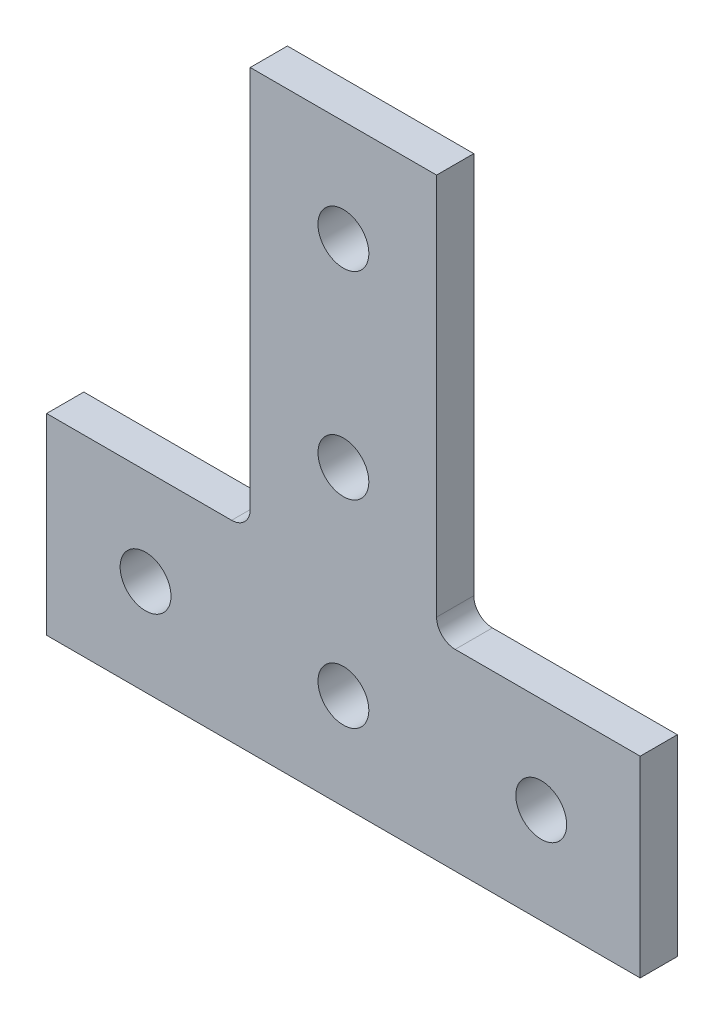
ISO-10303-21;
HEADER;
FILE_DESCRIPTION(('STEP AP214'),'2;1');
FILE_NAME('part.step','',(''),(''),'','','');
FILE_SCHEMA(('AUTOMOTIVE_DESIGN { 1 0 10303 214 1 1 1 1 }'));
ENDSEC;
DATA;
#1=APPLICATION_CONTEXT('core data for automotive mechanical design processes');
#2=APPLICATION_PROTOCOL_DEFINITION('international standard','automotive_design',2000,#1);
#3=PRODUCT_CONTEXT('',#1,'mechanical');
#4=PRODUCT('Part','Part','',(#3));
#5=PRODUCT_RELATED_PRODUCT_CATEGORY('part','',(#4));
#6=PRODUCT_DEFINITION_FORMATION('','',#4);
#7=PRODUCT_DEFINITION_CONTEXT('part definition',#1,'design');
#8=PRODUCT_DEFINITION('design','',#6,#7);
#9=PRODUCT_DEFINITION_SHAPE('','',#8);
#10=(LENGTH_UNIT() NAMED_UNIT(*) SI_UNIT(.MILLI.,.METRE.));
#11=(NAMED_UNIT(*) PLANE_ANGLE_UNIT() SI_UNIT($,.RADIAN.));
#12=(NAMED_UNIT(*) SI_UNIT($,.STERADIAN.) SOLID_ANGLE_UNIT());
#13=UNCERTAINTY_MEASURE_WITH_UNIT(LENGTH_MEASURE(1.E-05),#10,'distance_accuracy_value','');
#14=(GEOMETRIC_REPRESENTATION_CONTEXT(3) GLOBAL_UNCERTAINTY_ASSIGNED_CONTEXT((#13)) GLOBAL_UNIT_ASSIGNED_CONTEXT((#10,
#11,#12)) REPRESENTATION_CONTEXT('',''));
#15=CARTESIAN_POINT('',(0.,0.,0.));
#16=DIRECTION('',(0.,0.,1.));
#17=DIRECTION('',(1.,0.,0.));
#18=AXIS2_PLACEMENT_3D('',#15,#16,#17);
#19=CARTESIAN_POINT('',(-11.9634,-11.049,-2.3876));
#20=DIRECTION('',(-1.,0.,0.));
#21=DIRECTION('',(0.,-1.,0.));
#22=AXIS2_PLACEMENT_3D('',#19,#20,#21);
#23=PLANE('',#22);
#24=DIRECTION('',(0.,0.,1.));
#25=VECTOR('',#24,1.);
#26=CARTESIAN_POINT('',(-11.9634,-11.049,-2.3876));
#27=LINE('',#26,#25);
#28=CARTESIAN_POINT('',(-11.9634,-11.049,-2.3876));
#29=VERTEX_POINT('',#28);
#30=CARTESIAN_POINT('',(-11.9634,-11.049,2.3876));
#31=VERTEX_POINT('',#30);
#32=EDGE_CURVE('E44',#29,#31,#27,.T.);
#33=ORIENTED_EDGE('',*,*,#32,.T.);
#34=DIRECTION('',(0.,-1.,0.));
#35=VECTOR('',#34,1.);
#36=CARTESIAN_POINT('',(-11.9634,-11.049,2.3876));
#37=LINE('',#36,#35);
#38=CARTESIAN_POINT('',(-11.9634,38.1,2.3876));
#39=VERTEX_POINT('',#38);
#40=EDGE_CURVE('E118',#39,#31,#37,.T.);
#41=ORIENTED_EDGE('',*,*,#40,.F.);
#42=DIRECTION('',(0.,0.,1.));
#43=VECTOR('',#42,1.);
#44=CARTESIAN_POINT('',(-11.9634,38.1,-2.3876));
#45=LINE('',#44,#43);
#46=CARTESIAN_POINT('',(-11.9634,38.1,-2.3876));
#47=VERTEX_POINT('',#46);
#48=EDGE_CURVE('E11',#47,#39,#45,.T.);
#49=ORIENTED_EDGE('',*,*,#48,.F.);
#50=DIRECTION('',(0.,-1.,0.));
#51=VECTOR('',#50,1.);
#52=CARTESIAN_POINT('',(-11.9634,-11.049,-2.3876));
#53=LINE('',#52,#51);
#54=EDGE_CURVE('E119',#47,#29,#53,.T.);
#55=ORIENTED_EDGE('',*,*,#54,.T.);
#56=EDGE_LOOP('',(#33,#41,#49,#55));
#57=FACE_BOUND('',#56,.T.);
#58=ADVANCED_FACE('F41',(#57),#23,.T.);
#59=CARTESIAN_POINT('',(11.9634,38.1,-2.3876));
#60=DIRECTION('',(0.,1.,0.));
#61=DIRECTION('',(0.,0.,1.));
#62=AXIS2_PLACEMENT_3D('',#59,#60,#61);
#63=PLANE('',#62);
#64=ORIENTED_EDGE('',*,*,#48,.T.);
#65=DIRECTION('',(-1.,0.,0.));
#66=VECTOR('',#65,1.);
#67=CARTESIAN_POINT('',(11.9634,38.1,2.3876));
#68=LINE('',#67,#66);
#69=CARTESIAN_POINT('',(11.9634,38.1,2.3876));
#70=VERTEX_POINT('',#69);
#71=EDGE_CURVE('E138',#70,#39,#68,.T.);
#72=ORIENTED_EDGE('',*,*,#71,.F.);
#73=DIRECTION('',(0.,0.,1.));
#74=VECTOR('',#73,1.);
#75=CARTESIAN_POINT('',(11.9634,38.1,-2.3876));
#76=LINE('',#75,#74);
#77=CARTESIAN_POINT('',(11.9634,38.1,-2.3876));
#78=VERTEX_POINT('',#77);
#79=EDGE_CURVE('E50',#78,#70,#76,.T.);
#80=ORIENTED_EDGE('',*,*,#79,.F.);
#81=DIRECTION('',(-1.,0.,0.));
#82=VECTOR('',#81,1.);
#83=CARTESIAN_POINT('',(11.9634,38.1,-2.3876));
#84=LINE('',#83,#82);
#85=EDGE_CURVE('E125',#78,#47,#84,.T.);
#86=ORIENTED_EDGE('',*,*,#85,.T.);
#87=EDGE_LOOP('',(#64,#72,#80,#86));
#88=FACE_BOUND('',#87,.T.);
#89=ADVANCED_FACE('F291',(#88),#63,.T.);
#90=CARTESIAN_POINT('',(11.9634,-11.049,-2.3876));
#91=DIRECTION('',(1.,0.,0.));
#92=DIRECTION('',(0.,0.,-1.));
#93=AXIS2_PLACEMENT_3D('',#90,#91,#92);
#94=PLANE('',#93);
#95=ORIENTED_EDGE('',*,*,#79,.T.);
#96=DIRECTION('',(0.,1.,0.));
#97=VECTOR('',#96,1.);
#98=CARTESIAN_POINT('',(11.9634,-11.049,2.3876));
#99=LINE('',#98,#97);
#100=CARTESIAN_POINT('',(11.9634,-11.049,2.3876));
#101=VERTEX_POINT('',#100);
#102=EDGE_CURVE('E173',#101,#70,#99,.T.);
#103=ORIENTED_EDGE('',*,*,#102,.F.);
#104=DIRECTION('',(0.,0.,1.));
#105=VECTOR('',#104,1.);
#106=CARTESIAN_POINT('',(11.9634,-11.049,-2.3876));
#107=LINE('',#106,#105);
#108=CARTESIAN_POINT('',(11.9634,-11.049,-2.3876));
#109=VERTEX_POINT('',#108);
#110=EDGE_CURVE('E214',#109,#101,#107,.T.);
#111=ORIENTED_EDGE('',*,*,#110,.F.);
#112=DIRECTION('',(0.,1.,0.));
#113=VECTOR('',#112,1.);
#114=CARTESIAN_POINT('',(11.9634,-11.049,-2.3876));
#115=LINE('',#114,#113);
#116=EDGE_CURVE('E207',#109,#78,#115,.T.);
#117=ORIENTED_EDGE('',*,*,#116,.T.);
#118=EDGE_LOOP('',(#95,#103,#111,#117));
#119=FACE_BOUND('',#118,.T.);
#120=ADVANCED_FACE('F289',(#119),#94,.T.);
#121=CARTESIAN_POINT('',(14.351,-11.049,-2.3876));
#122=DIRECTION('',(0.,0.,1.));
#123=DIRECTION('',(1.,0.,0.));
#124=AXIS2_PLACEMENT_3D('',#121,#122,#123);
#125=CYLINDRICAL_SURFACE('',#124,2.3876);
#126=ORIENTED_EDGE('',*,*,#110,.T.);
#127=CARTESIAN_POINT('',(14.351,-11.049,2.3876));
#128=DIRECTION('',(0.,0.,-1.));
#129=DIRECTION('',(-1.,0.,0.));
#130=AXIS2_PLACEMENT_3D('',#127,#128,#129);
#131=CIRCLE('',#130,2.3876);
#132=CARTESIAN_POINT('',(14.351,-13.4366,2.3876));
#133=VERTEX_POINT('',#132);
#134=EDGE_CURVE('E169',#133,#101,#131,.T.);
#135=ORIENTED_EDGE('',*,*,#134,.F.);
#136=DIRECTION('',(0.,0.,1.));
#137=VECTOR('',#136,1.);
#138=CARTESIAN_POINT('',(14.351,-13.4366,-2.3876));
#139=LINE('',#138,#137);
#140=CARTESIAN_POINT('',(14.351,-13.4366,-2.3876));
#141=VERTEX_POINT('',#140);
#142=EDGE_CURVE('E217',#141,#133,#139,.T.);
#143=ORIENTED_EDGE('',*,*,#142,.F.);
#144=CARTESIAN_POINT('',(14.351,-11.049,-2.3876));
#145=DIRECTION('',(0.,0.,-1.));
#146=DIRECTION('',(-1.,0.,0.));
#147=AXIS2_PLACEMENT_3D('',#144,#145,#146);
#148=CIRCLE('',#147,2.3876);
#149=EDGE_CURVE('E203',#141,#109,#148,.T.);
#150=ORIENTED_EDGE('',*,*,#149,.T.);
#151=EDGE_LOOP('',(#126,#135,#143,#150));
#152=FACE_BOUND('',#151,.T.);
#153=ADVANCED_FACE('F285',(#152),#125,.F.);
#154=CARTESIAN_POINT('',(38.1,-13.4366,-2.3876));
#155=DIRECTION('',(0.,1.,0.));
#156=DIRECTION('',(-1.,0.,0.));
#157=AXIS2_PLACEMENT_3D('',#154,#155,#156);
#158=PLANE('',#157);
#159=ORIENTED_EDGE('',*,*,#142,.T.);
#160=DIRECTION('',(-1.,0.,0.));
#161=VECTOR('',#160,1.);
#162=CARTESIAN_POINT('',(38.1,-13.4366,2.3876));
#163=LINE('',#162,#161);
#164=CARTESIAN_POINT('',(38.1,-13.4366,2.3876));
#165=VERTEX_POINT('',#164);
#166=EDGE_CURVE('E165',#165,#133,#163,.T.);
#167=ORIENTED_EDGE('',*,*,#166,.F.);
#168=DIRECTION('',(0.,0.,1.));
#169=VECTOR('',#168,1.);
#170=CARTESIAN_POINT('',(38.1,-13.4366,-2.3876));
#171=LINE('',#170,#169);
#172=CARTESIAN_POINT('',(38.1,-13.4366,-2.3876));
#173=VERTEX_POINT('',#172);
#174=EDGE_CURVE('E220',#173,#165,#171,.T.);
#175=ORIENTED_EDGE('',*,*,#174,.F.);
#176=DIRECTION('',(-1.,0.,0.));
#177=VECTOR('',#176,1.);
#178=CARTESIAN_POINT('',(38.1,-13.4366,-2.3876));
#179=LINE('',#178,#177);
#180=EDGE_CURVE('E199',#173,#141,#179,.T.);
#181=ORIENTED_EDGE('',*,*,#180,.T.);
#182=EDGE_LOOP('',(#159,#167,#175,#181));
#183=FACE_BOUND('',#182,.T.);
#184=ADVANCED_FACE('F283',(#183),#158,.T.);
#185=CARTESIAN_POINT('',(38.1,-38.1,-2.3876));
#186=DIRECTION('',(1.,0.,0.));
#187=DIRECTION('',(0.,0.,-1.));
#188=AXIS2_PLACEMENT_3D('',#185,#186,#187);
#189=PLANE('',#188);
#190=ORIENTED_EDGE('',*,*,#174,.T.);
#191=DIRECTION('',(0.,1.,0.));
#192=VECTOR('',#191,1.);
#193=CARTESIAN_POINT('',(38.1,-38.1,2.3876));
#194=LINE('',#193,#192);
#195=CARTESIAN_POINT('',(38.1,-38.1,2.3876));
#196=VERTEX_POINT('',#195);
#197=EDGE_CURVE('E161',#196,#165,#194,.T.);
#198=ORIENTED_EDGE('',*,*,#197,.F.);
#199=DIRECTION('',(0.,0.,1.));
#200=VECTOR('',#199,1.);
#201=CARTESIAN_POINT('',(38.1,-38.1,-2.3876));
#202=LINE('',#201,#200);
#203=CARTESIAN_POINT('',(38.1,-38.1,-2.3876));
#204=VERTEX_POINT('',#203);
#205=EDGE_CURVE('E223',#204,#196,#202,.T.);
#206=ORIENTED_EDGE('',*,*,#205,.F.);
#207=DIRECTION('',(0.,1.,0.));
#208=VECTOR('',#207,1.);
#209=CARTESIAN_POINT('',(38.1,-38.1,-2.3876));
#210=LINE('',#209,#208);
#211=EDGE_CURVE('E195',#204,#173,#210,.T.);
#212=ORIENTED_EDGE('',*,*,#211,.T.);
#213=EDGE_LOOP('',(#190,#198,#206,#212));
#214=FACE_BOUND('',#213,.T.);
#215=ADVANCED_FACE('F278',(#214),#189,.T.);
#216=CARTESIAN_POINT('',(38.1,-38.1,-2.3876));
#217=DIRECTION('',(0.,-1.,0.));
#218=DIRECTION('',(1.,0.,0.));
#219=AXIS2_PLACEMENT_3D('',#216,#217,#218);
#220=PLANE('',#219);
#221=ORIENTED_EDGE('',*,*,#205,.T.);
#222=DIRECTION('',(1.,0.,0.));
#223=VECTOR('',#222,1.);
#224=CARTESIAN_POINT('',(38.1,-38.1,2.3876));
#225=LINE('',#224,#223);
#226=CARTESIAN_POINT('',(-38.1,-38.1,2.3876));
#227=VERTEX_POINT('',#226);
#228=EDGE_CURVE('E157',#227,#196,#225,.T.);
#229=ORIENTED_EDGE('',*,*,#228,.F.);
#230=DIRECTION('',(0.,0.,1.));
#231=VECTOR('',#230,1.);
#232=CARTESIAN_POINT('',(-38.1,-38.1,-2.3876));
#233=LINE('',#232,#231);
#234=CARTESIAN_POINT('',(-38.1,-38.1,-2.3876));
#235=VERTEX_POINT('',#234);
#236=EDGE_CURVE('E226',#235,#227,#233,.T.);
#237=ORIENTED_EDGE('',*,*,#236,.F.);
#238=DIRECTION('',(1.,0.,0.));
#239=VECTOR('',#238,1.);
#240=CARTESIAN_POINT('',(38.1,-38.1,-2.3876));
#241=LINE('',#240,#239);
#242=EDGE_CURVE('E191',#235,#204,#241,.T.);
#243=ORIENTED_EDGE('',*,*,#242,.T.);
#244=EDGE_LOOP('',(#221,#229,#237,#243));
#245=FACE_BOUND('',#244,.T.);
#246=ADVANCED_FACE('F271',(#245),#220,.T.);
#247=CARTESIAN_POINT('',(-38.1,-38.1,-2.3876));
#248=DIRECTION('',(-1.,0.,0.));
#249=DIRECTION('',(0.,0.,1.));
#250=AXIS2_PLACEMENT_3D('',#247,#248,#249);
#251=PLANE('',#250);
#252=ORIENTED_EDGE('',*,*,#236,.T.);
#253=DIRECTION('',(0.,-1.,0.));
#254=VECTOR('',#253,1.);
#255=CARTESIAN_POINT('',(-38.1,-38.1,2.3876));
#256=LINE('',#255,#254);
#257=CARTESIAN_POINT('',(-38.1,-13.4366,2.3876));
#258=VERTEX_POINT('',#257);
#259=EDGE_CURVE('E153',#258,#227,#256,.T.);
#260=ORIENTED_EDGE('',*,*,#259,.F.);
#261=DIRECTION('',(0.,0.,1.));
#262=VECTOR('',#261,1.);
#263=CARTESIAN_POINT('',(-38.1,-13.4366,-2.3876));
#264=LINE('',#263,#262);
#265=CARTESIAN_POINT('',(-38.1,-13.4366,-2.3876));
#266=VERTEX_POINT('',#265);
#267=EDGE_CURVE('E229',#266,#258,#264,.T.);
#268=ORIENTED_EDGE('',*,*,#267,.F.);
#269=DIRECTION('',(0.,-1.,0.));
#270=VECTOR('',#269,1.);
#271=CARTESIAN_POINT('',(-38.1,-38.1,-2.3876));
#272=LINE('',#271,#270);
#273=EDGE_CURVE('E187',#266,#235,#272,.T.);
#274=ORIENTED_EDGE('',*,*,#273,.T.);
#275=EDGE_LOOP('',(#252,#260,#268,#274));
#276=FACE_BOUND('',#275,.T.);
#277=ADVANCED_FACE('F268',(#276),#251,.T.);
#278=CARTESIAN_POINT('',(-38.1,-13.4366,-2.3876));
#279=DIRECTION('',(0.,1.,0.));
#280=DIRECTION('',(-1.,0.,0.));
#281=AXIS2_PLACEMENT_3D('',#278,#279,#280);
#282=PLANE('',#281);
#283=ORIENTED_EDGE('',*,*,#267,.T.);
#284=DIRECTION('',(-1.,0.,0.));
#285=VECTOR('',#284,1.);
#286=CARTESIAN_POINT('',(-38.1,-13.4366,2.3876));
#287=LINE('',#286,#285);
#288=CARTESIAN_POINT('',(-14.351,-13.4366,2.3876));
#289=VERTEX_POINT('',#288);
#290=EDGE_CURVE('E133',#289,#258,#287,.T.);
#291=ORIENTED_EDGE('',*,*,#290,.F.);
#292=DIRECTION('',(0.,0.,1.));
#293=VECTOR('',#292,1.);
#294=CARTESIAN_POINT('',(-14.351,-13.4366,-2.3876));
#295=LINE('',#294,#293);
#296=CARTESIAN_POINT('',(-14.351,-13.4366,-2.3876));
#297=VERTEX_POINT('',#296);
#298=EDGE_CURVE('E124',#297,#289,#295,.T.);
#299=ORIENTED_EDGE('',*,*,#298,.F.);
#300=DIRECTION('',(-1.,0.,0.));
#301=VECTOR('',#300,1.);
#302=CARTESIAN_POINT('',(-38.1,-13.4366,-2.3876));
#303=LINE('',#302,#301);
#304=EDGE_CURVE('E183',#297,#266,#303,.T.);
#305=ORIENTED_EDGE('',*,*,#304,.T.);
#306=EDGE_LOOP('',(#283,#291,#299,#305));
#307=FACE_BOUND('',#306,.T.);
#308=ADVANCED_FACE('F262',(#307),#282,.T.);
#309=CARTESIAN_POINT('',(-14.351,-11.049,-2.3876));
#310=DIRECTION('',(0.,0.,1.));
#311=DIRECTION('',(1.,0.,0.));
#312=AXIS2_PLACEMENT_3D('',#309,#310,#311);
#313=CYLINDRICAL_SURFACE('',#312,2.3876);
#314=ORIENTED_EDGE('',*,*,#298,.T.);
#315=CARTESIAN_POINT('',(-14.351,-11.049,2.3876));
#316=DIRECTION('',(0.,0.,-1.));
#317=DIRECTION('',(-1.,0.,0.));
#318=AXIS2_PLACEMENT_3D('',#315,#316,#317);
#319=CIRCLE('',#318,2.3876);
#320=EDGE_CURVE('E127',#31,#289,#319,.T.);
#321=ORIENTED_EDGE('',*,*,#320,.F.);
#322=ORIENTED_EDGE('',*,*,#32,.F.);
#323=CARTESIAN_POINT('',(-14.351,-11.049,-2.3876));
#324=DIRECTION('',(0.,0.,-1.));
#325=DIRECTION('',(-1.,0.,0.));
#326=AXIS2_PLACEMENT_3D('',#323,#324,#325);
#327=CIRCLE('',#326,2.3876);
#328=EDGE_CURVE('E180',#29,#297,#327,.T.);
#329=ORIENTED_EDGE('',*,*,#328,.T.);
#330=EDGE_LOOP('',(#314,#321,#322,#329));
#331=FACE_BOUND('',#330,.T.);
#332=ADVANCED_FACE('F128',(#331),#313,.F.);
#333=CARTESIAN_POINT('',(14.351,-11.049,-2.3876));
#334=DIRECTION('',(0.,0.,-1.));
#335=DIRECTION('',(-1.,0.,0.));
#336=AXIS2_PLACEMENT_3D('',#333,#334,#335);
#337=PLANE('',#336);
#338=CARTESIAN_POINT('',(25.4,-25.7683,-2.3876));
#339=DIRECTION('',(0.,0.,1.));
#340=DIRECTION('',(1.,0.,0.));
#341=AXIS2_PLACEMENT_3D('',#338,#339,#340);
#342=CIRCLE('',#341,3.2639);
#343=CARTESIAN_POINT('',(28.6639,-25.7683,-2.3876));
#344=VERTEX_POINT('',#343);
#345=EDGE_CURVE('E140',#344,#344,#342,.T.);
#346=ORIENTED_EDGE('',*,*,#345,.T.);
#347=EDGE_LOOP('',(#346));
#348=FACE_BOUND('',#347,.T.);
#349=CARTESIAN_POINT('',(0.,-25.7683,-2.3876));
#350=DIRECTION('',(0.,0.,1.));
#351=DIRECTION('',(1.,0.,0.));
#352=AXIS2_PLACEMENT_3D('',#349,#350,#351);
#353=CIRCLE('',#352,3.2639);
#354=CARTESIAN_POINT('',(3.2639,-25.7683,-2.3876));
#355=VERTEX_POINT('',#354);
#356=EDGE_CURVE('E328',#355,#355,#353,.T.);
#357=ORIENTED_EDGE('',*,*,#356,.T.);
#358=EDGE_LOOP('',(#357));
#359=FACE_BOUND('',#358,.T.);
#360=CARTESIAN_POINT('',(-25.4,-25.7683,-2.3876));
#361=DIRECTION('',(0.,0.,1.));
#362=DIRECTION('',(1.,0.,0.));
#363=AXIS2_PLACEMENT_3D('',#360,#361,#362);
#364=CIRCLE('',#363,3.2639);
#365=CARTESIAN_POINT('',(-22.1361,-25.7683,-2.3876));
#366=VERTEX_POINT('',#365);
#367=EDGE_CURVE('E332',#366,#366,#364,.T.);
#368=ORIENTED_EDGE('',*,*,#367,.T.);
#369=EDGE_LOOP('',(#368));
#370=FACE_BOUND('',#369,.T.);
#371=CARTESIAN_POINT('',(0.,-0.368299999999988,-2.3876));
#372=DIRECTION('',(0.,0.,1.));
#373=DIRECTION('',(1.,0.,0.));
#374=AXIS2_PLACEMENT_3D('',#371,#372,#373);
#375=CIRCLE('',#374,3.2639);
#376=CARTESIAN_POINT('',(3.2639,-0.368299999999988,-2.3876));
#377=VERTEX_POINT('',#376);
#378=EDGE_CURVE('E336',#377,#377,#375,.T.);
#379=ORIENTED_EDGE('',*,*,#378,.T.);
#380=EDGE_LOOP('',(#379));
#381=FACE_BOUND('',#380,.T.);
#382=CARTESIAN_POINT('',(0.,25.0317,-2.3876));
#383=DIRECTION('',(0.,0.,1.));
#384=DIRECTION('',(-1.,0.,0.));
#385=AXIS2_PLACEMENT_3D('',#382,#383,#384);
#386=CIRCLE('',#385,3.2639);
#387=CARTESIAN_POINT('',(-3.2639,25.0317,-2.3876));
#388=VERTEX_POINT('',#387);
#389=EDGE_CURVE('E339',#388,#388,#386,.T.);
#390=ORIENTED_EDGE('',*,*,#389,.T.);
#391=EDGE_LOOP('',(#390));
#392=FACE_BOUND('',#391,.T.);
#393=ORIENTED_EDGE('',*,*,#54,.F.);
#394=ORIENTED_EDGE('',*,*,#85,.F.);
#395=ORIENTED_EDGE('',*,*,#116,.F.);
#396=ORIENTED_EDGE('',*,*,#149,.F.);
#397=ORIENTED_EDGE('',*,*,#180,.F.);
#398=ORIENTED_EDGE('',*,*,#211,.F.);
#399=ORIENTED_EDGE('',*,*,#242,.F.);
#400=ORIENTED_EDGE('',*,*,#273,.F.);
#401=ORIENTED_EDGE('',*,*,#304,.F.);
#402=ORIENTED_EDGE('',*,*,#328,.F.);
#403=EDGE_LOOP('',(#393,#394,#395,#396,#397,#398,#399,#400,#401,#402));
#404=FACE_BOUND('',#403,.T.);
#405=ADVANCED_FACE('F274',(#348,#359,#370,#381,#392,#404),#337,.T.);
#406=CARTESIAN_POINT('',(14.351,-11.049,2.3876));
#407=DIRECTION('',(0.,0.,-1.));
#408=DIRECTION('',(-1.,0.,0.));
#409=AXIS2_PLACEMENT_3D('',#406,#407,#408);
#410=PLANE('',#409);
#411=CARTESIAN_POINT('',(25.4,-25.7683,2.3876));
#412=DIRECTION('',(0.,0.,1.));
#413=DIRECTION('',(1.,0.,0.));
#414=AXIS2_PLACEMENT_3D('',#411,#412,#413);
#415=CIRCLE('',#414,3.2639);
#416=CARTESIAN_POINT('',(28.6639,-25.7683,2.3876));
#417=VERTEX_POINT('',#416);
#418=EDGE_CURVE('E145',#417,#417,#415,.T.);
#419=ORIENTED_EDGE('',*,*,#418,.F.);
#420=EDGE_LOOP('',(#419));
#421=FACE_BOUND('',#420,.T.);
#422=CARTESIAN_POINT('',(0.,-25.7683,2.3876));
#423=DIRECTION('',(0.,0.,1.));
#424=DIRECTION('',(1.,0.,0.));
#425=AXIS2_PLACEMENT_3D('',#422,#423,#424);
#426=CIRCLE('',#425,3.2639);
#427=CARTESIAN_POINT('',(3.2639,-25.7683,2.3876));
#428=VERTEX_POINT('',#427);
#429=EDGE_CURVE('E358',#428,#428,#426,.T.);
#430=ORIENTED_EDGE('',*,*,#429,.F.);
#431=EDGE_LOOP('',(#430));
#432=FACE_BOUND('',#431,.T.);
#433=CARTESIAN_POINT('',(-25.4,-25.7683,2.3876));
#434=DIRECTION('',(0.,0.,1.));
#435=DIRECTION('',(1.,0.,0.));
#436=AXIS2_PLACEMENT_3D('',#433,#434,#435);
#437=CIRCLE('',#436,3.2639);
#438=CARTESIAN_POINT('',(-22.1361,-25.7683,2.3876));
#439=VERTEX_POINT('',#438);
#440=EDGE_CURVE('E352',#439,#439,#437,.T.);
#441=ORIENTED_EDGE('',*,*,#440,.F.);
#442=EDGE_LOOP('',(#441));
#443=FACE_BOUND('',#442,.T.);
#444=CARTESIAN_POINT('',(0.,-0.368299999999988,2.3876));
#445=DIRECTION('',(0.,0.,1.));
#446=DIRECTION('',(1.,0.,0.));
#447=AXIS2_PLACEMENT_3D('',#444,#445,#446);
#448=CIRCLE('',#447,3.2639);
#449=CARTESIAN_POINT('',(3.2639,-0.368299999999988,2.3876));
#450=VERTEX_POINT('',#449);
#451=EDGE_CURVE('E342',#450,#450,#448,.T.);
#452=ORIENTED_EDGE('',*,*,#451,.F.);
#453=EDGE_LOOP('',(#452));
#454=FACE_BOUND('',#453,.T.);
#455=CARTESIAN_POINT('',(0.,25.0317,2.3876));
#456=DIRECTION('',(0.,0.,1.));
#457=DIRECTION('',(-1.,0.,0.));
#458=AXIS2_PLACEMENT_3D('',#455,#456,#457);
#459=CIRCLE('',#458,3.2639);
#460=CARTESIAN_POINT('',(-3.2639,25.0317,2.3876));
#461=VERTEX_POINT('',#460);
#462=EDGE_CURVE('E148',#461,#461,#459,.T.);
#463=ORIENTED_EDGE('',*,*,#462,.F.);
#464=EDGE_LOOP('',(#463));
#465=FACE_BOUND('',#464,.T.);
#466=ORIENTED_EDGE('',*,*,#40,.T.);
#467=ORIENTED_EDGE('',*,*,#320,.T.);
#468=ORIENTED_EDGE('',*,*,#290,.T.);
#469=ORIENTED_EDGE('',*,*,#259,.T.);
#470=ORIENTED_EDGE('',*,*,#228,.T.);
#471=ORIENTED_EDGE('',*,*,#197,.T.);
#472=ORIENTED_EDGE('',*,*,#166,.T.);
#473=ORIENTED_EDGE('',*,*,#134,.T.);
#474=ORIENTED_EDGE('',*,*,#102,.T.);
#475=ORIENTED_EDGE('',*,*,#71,.T.);
#476=EDGE_LOOP('',(#466,#467,#468,#469,#470,#471,#472,#473,#474,#475));
#477=FACE_BOUND('',#476,.T.);
#478=ADVANCED_FACE('F136',(#421,#432,#443,#454,#465,#477),#410,.F.);
#479=CARTESIAN_POINT('',(0.,25.0317,-2.3876));
#480=DIRECTION('',(0.,0.,1.));
#481=DIRECTION('',(1.,0.,0.));
#482=AXIS2_PLACEMENT_3D('',#479,#480,#481);
#483=CYLINDRICAL_SURFACE('',#482,3.2639);
#484=ORIENTED_EDGE('',*,*,#389,.F.);
#485=EDGE_LOOP('',(#484));
#486=FACE_BOUND('',#485,.T.);
#487=ORIENTED_EDGE('',*,*,#462,.T.);
#488=EDGE_LOOP('',(#487));
#489=FACE_BOUND('',#488,.T.);
#490=ADVANCED_FACE('F321',(#486,#489),#483,.F.);
#491=CARTESIAN_POINT('',(0.,-0.368299999999988,-2.3876));
#492=DIRECTION('',(0.,0.,1.));
#493=DIRECTION('',(1.,0.,0.));
#494=AXIS2_PLACEMENT_3D('',#491,#492,#493);
#495=CYLINDRICAL_SURFACE('',#494,3.2639);
#496=ORIENTED_EDGE('',*,*,#378,.F.);
#497=EDGE_LOOP('',(#496));
#498=FACE_BOUND('',#497,.T.);
#499=ORIENTED_EDGE('',*,*,#451,.T.);
#500=EDGE_LOOP('',(#499));
#501=FACE_BOUND('',#500,.T.);
#502=ADVANCED_FACE('F380',(#498,#501),#495,.F.);
#503=CARTESIAN_POINT('',(-25.4,-25.7683,-2.3876));
#504=DIRECTION('',(0.,0.,1.));
#505=DIRECTION('',(1.,0.,0.));
#506=AXIS2_PLACEMENT_3D('',#503,#504,#505);
#507=CYLINDRICAL_SURFACE('',#506,3.2639);
#508=ORIENTED_EDGE('',*,*,#367,.F.);
#509=EDGE_LOOP('',(#508));
#510=FACE_BOUND('',#509,.T.);
#511=ORIENTED_EDGE('',*,*,#440,.T.);
#512=EDGE_LOOP('',(#511));
#513=FACE_BOUND('',#512,.T.);
#514=ADVANCED_FACE('F385',(#510,#513),#507,.F.);
#515=CARTESIAN_POINT('',(0.,-25.7683,-2.3876));
#516=DIRECTION('',(0.,0.,1.));
#517=DIRECTION('',(1.,0.,0.));
#518=AXIS2_PLACEMENT_3D('',#515,#516,#517);
#519=CYLINDRICAL_SURFACE('',#518,3.2639);
#520=ORIENTED_EDGE('',*,*,#356,.F.);
#521=EDGE_LOOP('',(#520));
#522=FACE_BOUND('',#521,.T.);
#523=ORIENTED_EDGE('',*,*,#429,.T.);
#524=EDGE_LOOP('',(#523));
#525=FACE_BOUND('',#524,.T.);
#526=ADVANCED_FACE('F391',(#522,#525),#519,.F.);
#527=CARTESIAN_POINT('',(25.4,-25.7683,-2.3876));
#528=DIRECTION('',(0.,0.,1.));
#529=DIRECTION('',(1.,0.,0.));
#530=AXIS2_PLACEMENT_3D('',#527,#528,#529);
#531=CYLINDRICAL_SURFACE('',#530,3.2639);
#532=ORIENTED_EDGE('',*,*,#345,.F.);
#533=EDGE_LOOP('',(#532));
#534=FACE_BOUND('',#533,.T.);
#535=ORIENTED_EDGE('',*,*,#418,.T.);
#536=EDGE_LOOP('',(#535));
#537=FACE_BOUND('',#536,.T.);
#538=ADVANCED_FACE('F369',(#534,#537),#531,.F.);
#539=CLOSED_SHELL('',(#58,#89,#120,#153,#184,#215,#246,#277,#308,#332,#405,#478,#490,#502,#514,
#526,#538));
#540=MANIFOLD_SOLID_BREP('B2',#539);
#541=ADVANCED_BREP_SHAPE_REPRESENTATION('',(#18,#540),#14);
#542=SHAPE_DEFINITION_REPRESENTATION(#9,#541);
ENDSEC;
END-ISO-10303-21;
